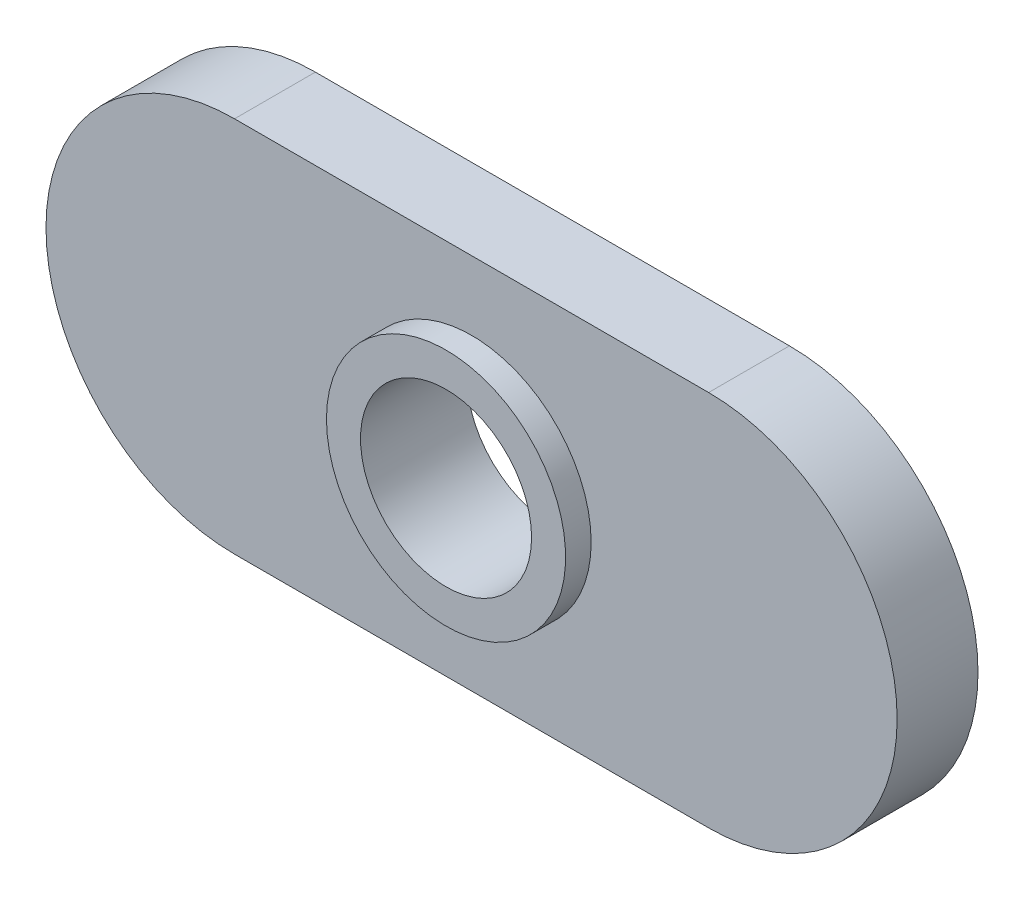
ISO-10303-21;
HEADER;
FILE_DESCRIPTION(('STEP AP214'),'2;1');
FILE_NAME('part.step','',(''),(''),'','','');
FILE_SCHEMA(('AUTOMOTIVE_DESIGN { 1 0 10303 214 1 1 1 1 }'));
ENDSEC;
DATA;
#1=APPLICATION_CONTEXT('core data for automotive mechanical design processes');
#2=APPLICATION_PROTOCOL_DEFINITION('international standard','automotive_design',2000,#1);
#3=PRODUCT_CONTEXT('',#1,'mechanical');
#4=PRODUCT('Part','Part','',(#3));
#5=PRODUCT_RELATED_PRODUCT_CATEGORY('part','',(#4));
#6=PRODUCT_DEFINITION_FORMATION('','',#4);
#7=PRODUCT_DEFINITION_CONTEXT('part definition',#1,'design');
#8=PRODUCT_DEFINITION('design','',#6,#7);
#9=PRODUCT_DEFINITION_SHAPE('','',#8);
#10=(LENGTH_UNIT() NAMED_UNIT(*) SI_UNIT(.MILLI.,.METRE.));
#11=(NAMED_UNIT(*) PLANE_ANGLE_UNIT() SI_UNIT($,.RADIAN.));
#12=(NAMED_UNIT(*) SI_UNIT($,.STERADIAN.) SOLID_ANGLE_UNIT());
#13=UNCERTAINTY_MEASURE_WITH_UNIT(LENGTH_MEASURE(1.E-05),#10,'distance_accuracy_value','');
#14=(GEOMETRIC_REPRESENTATION_CONTEXT(3) GLOBAL_UNCERTAINTY_ASSIGNED_CONTEXT((#13)) GLOBAL_UNIT_ASSIGNED_CONTEXT((#10,
#11,#12)) REPRESENTATION_CONTEXT('',''));
#15=CARTESIAN_POINT('',(0.,0.,0.));
#16=DIRECTION('',(0.,0.,1.));
#17=DIRECTION('',(1.,0.,0.));
#18=AXIS2_PLACEMENT_3D('',#15,#16,#17);
#19=CARTESIAN_POINT('',(111.278662660247,125.933065895994,0.));
#20=DIRECTION('',(0.,0.,1.));
#21=DIRECTION('',(1.,0.,0.));
#22=AXIS2_PLACEMENT_3D('',#19,#20,#21);
#23=CYLINDRICAL_SURFACE('',#22,5.62609999999999);
#24=CARTESIAN_POINT('',(111.278662660247,125.933065895994,2.413));
#25=DIRECTION('',(0.,0.,1.));
#26=DIRECTION('',(1.,0.,0.));
#27=AXIS2_PLACEMENT_3D('',#24,#25,#26);
#28=CIRCLE('',#27,5.62609999999999);
#29=CARTESIAN_POINT('',(111.278662660247,131.559165895994,2.413));
#30=VERTEX_POINT('',#29);
#31=CARTESIAN_POINT('',(111.278662660247,120.306965895994,2.413));
#32=VERTEX_POINT('',#31);
#33=EDGE_CURVE('E99',#30,#32,#28,.T.);
#34=ORIENTED_EDGE('',*,*,#33,.F.);
#35=DIRECTION('',(0.,0.,1.));
#36=VECTOR('',#35,1.);
#37=CARTESIAN_POINT('',(111.278662660247,131.559165895994,0.));
#38=LINE('',#37,#36);
#39=CARTESIAN_POINT('',(111.278662660247,131.559165895994,0.));
#40=VERTEX_POINT('',#39);
#41=EDGE_CURVE('E40',#40,#30,#38,.T.);
#42=ORIENTED_EDGE('',*,*,#41,.F.);
#43=CARTESIAN_POINT('',(111.278662660247,125.933065895994,0.));
#44=DIRECTION('',(0.,0.,1.));
#45=DIRECTION('',(1.,0.,0.));
#46=AXIS2_PLACEMENT_3D('',#43,#44,#45);
#47=CIRCLE('',#46,5.62609999999999);
#48=CARTESIAN_POINT('',(111.278662660247,120.306965895994,0.));
#49=VERTEX_POINT('',#48);
#50=EDGE_CURVE('E92',#40,#49,#47,.T.);
#51=ORIENTED_EDGE('',*,*,#50,.T.);
#52=DIRECTION('',(0.,0.,1.));
#53=VECTOR('',#52,1.);
#54=CARTESIAN_POINT('',(111.278662660247,120.306965895994,0.));
#55=LINE('',#54,#53);
#56=EDGE_CURVE('E75',#49,#32,#55,.T.);
#57=ORIENTED_EDGE('',*,*,#56,.T.);
#58=EDGE_LOOP('',(#34,#42,#51,#57));
#59=FACE_BOUND('',#58,.T.);
#60=ADVANCED_FACE('F32',(#59),#23,.T.);
#61=CARTESIAN_POINT('',(125.426462660247,131.559165895994,0.));
#62=DIRECTION('',(0.,1.,0.));
#63=DIRECTION('',(0.,0.,1.));
#64=AXIS2_PLACEMENT_3D('',#61,#62,#63);
#65=PLANE('',#64);
#66=DIRECTION('',(-1.,0.,0.));
#67=VECTOR('',#66,1.);
#68=CARTESIAN_POINT('',(125.426462660247,131.559165895994,2.413));
#69=LINE('',#68,#67);
#70=CARTESIAN_POINT('',(125.426462660247,131.559165895994,2.413));
#71=VERTEX_POINT('',#70);
#72=EDGE_CURVE('E94',#71,#30,#69,.T.);
#73=ORIENTED_EDGE('',*,*,#72,.F.);
#74=DIRECTION('',(0.,0.,1.));
#75=VECTOR('',#74,1.);
#76=CARTESIAN_POINT('',(125.426462660247,131.559165895994,0.));
#77=LINE('',#76,#75);
#78=CARTESIAN_POINT('',(125.426462660247,131.559165895994,0.));
#79=VERTEX_POINT('',#78);
#80=EDGE_CURVE('E64',#79,#71,#77,.T.);
#81=ORIENTED_EDGE('',*,*,#80,.F.);
#82=DIRECTION('',(-1.,0.,0.));
#83=VECTOR('',#82,1.);
#84=CARTESIAN_POINT('',(125.426462660247,131.559165895994,0.));
#85=LINE('',#84,#83);
#86=EDGE_CURVE('E89',#79,#40,#85,.T.);
#87=ORIENTED_EDGE('',*,*,#86,.T.);
#88=ORIENTED_EDGE('',*,*,#41,.T.);
#89=EDGE_LOOP('',(#73,#81,#87,#88));
#90=FACE_BOUND('',#89,.T.);
#91=ADVANCED_FACE('F111',(#90),#65,.T.);
#92=CARTESIAN_POINT('',(125.426462660247,125.933065895994,0.));
#93=DIRECTION('',(0.,0.,1.));
#94=DIRECTION('',(1.,0.,0.));
#95=AXIS2_PLACEMENT_3D('',#92,#93,#94);
#96=CYLINDRICAL_SURFACE('',#95,5.62609999999999);
#97=CARTESIAN_POINT('',(125.426462660247,125.933065895994,2.413));
#98=DIRECTION('',(0.,0.,1.));
#99=DIRECTION('',(1.,0.,0.));
#100=AXIS2_PLACEMENT_3D('',#97,#98,#99);
#101=CIRCLE('',#100,5.62609999999999);
#102=CARTESIAN_POINT('',(125.426462660247,120.306965895994,2.413));
#103=VERTEX_POINT('',#102);
#104=EDGE_CURVE('E83',#103,#71,#101,.T.);
#105=ORIENTED_EDGE('',*,*,#104,.F.);
#106=DIRECTION('',(0.,0.,1.));
#107=VECTOR('',#106,1.);
#108=CARTESIAN_POINT('',(125.426462660247,120.306965895994,0.));
#109=LINE('',#108,#107);
#110=CARTESIAN_POINT('',(125.426462660247,120.306965895994,0.));
#111=VERTEX_POINT('',#110);
#112=EDGE_CURVE('E78',#111,#103,#109,.T.);
#113=ORIENTED_EDGE('',*,*,#112,.F.);
#114=CARTESIAN_POINT('',(125.426462660247,125.933065895994,0.));
#115=DIRECTION('',(0.,0.,1.));
#116=DIRECTION('',(1.,0.,0.));
#117=AXIS2_PLACEMENT_3D('',#114,#115,#116);
#118=CIRCLE('',#117,5.62609999999999);
#119=EDGE_CURVE('E81',#111,#79,#118,.T.);
#120=ORIENTED_EDGE('',*,*,#119,.T.);
#121=ORIENTED_EDGE('',*,*,#80,.T.);
#122=EDGE_LOOP('',(#105,#113,#120,#121));
#123=FACE_BOUND('',#122,.T.);
#124=ADVANCED_FACE('F80',(#123),#96,.T.);
#125=CARTESIAN_POINT('',(111.278662660247,120.306965895994,0.));
#126=DIRECTION('',(0.,-1.,0.));
#127=DIRECTION('',(1.,0.,0.));
#128=AXIS2_PLACEMENT_3D('',#125,#126,#127);
#129=PLANE('',#128);
#130=DIRECTION('',(1.,0.,0.));
#131=VECTOR('',#130,1.);
#132=CARTESIAN_POINT('',(111.278662660247,120.306965895994,2.413));
#133=LINE('',#132,#131);
#134=EDGE_CURVE('E102',#32,#103,#133,.T.);
#135=ORIENTED_EDGE('',*,*,#134,.F.);
#136=ORIENTED_EDGE('',*,*,#56,.F.);
#137=DIRECTION('',(1.,0.,0.));
#138=VECTOR('',#137,1.);
#139=CARTESIAN_POINT('',(111.278662660247,120.306965895994,0.));
#140=LINE('',#139,#138);
#141=EDGE_CURVE('E88',#49,#111,#140,.T.);
#142=ORIENTED_EDGE('',*,*,#141,.T.);
#143=ORIENTED_EDGE('',*,*,#112,.T.);
#144=EDGE_LOOP('',(#135,#136,#142,#143));
#145=FACE_BOUND('',#144,.T.);
#146=ADVANCED_FACE('F91',(#145),#129,.T.);
#147=CARTESIAN_POINT('',(111.278662660247,125.933065895994,0.));
#148=DIRECTION('',(0.,0.,1.));
#149=DIRECTION('',(1.,0.,0.));
#150=AXIS2_PLACEMENT_3D('',#147,#148,#149);
#151=PLANE('',#150);
#152=CARTESIAN_POINT('',(118.352562660247,125.933065895994,0.));
#153=DIRECTION('',(0.,0.,1.));
#154=DIRECTION('',(1.,0.,0.));
#155=AXIS2_PLACEMENT_3D('',#152,#153,#154);
#156=CIRCLE('',#155,2.55269999999999);
#157=CARTESIAN_POINT('',(120.905262660247,125.933065895994,0.));
#158=VERTEX_POINT('',#157);
#159=EDGE_CURVE('E150',#158,#158,#156,.T.);
#160=ORIENTED_EDGE('',*,*,#159,.T.);
#161=EDGE_LOOP('',(#160));
#162=FACE_BOUND('',#161,.T.);
#163=ORIENTED_EDGE('',*,*,#50,.F.);
#164=ORIENTED_EDGE('',*,*,#86,.F.);
#165=ORIENTED_EDGE('',*,*,#119,.F.);
#166=ORIENTED_EDGE('',*,*,#141,.F.);
#167=EDGE_LOOP('',(#163,#164,#165,#166));
#168=FACE_BOUND('',#167,.T.);
#169=ADVANCED_FACE('F87',(#162,#168),#151,.F.);
#170=CARTESIAN_POINT('',(111.278662660247,125.933065895994,2.413));
#171=DIRECTION('',(0.,0.,1.));
#172=DIRECTION('',(1.,0.,0.));
#173=AXIS2_PLACEMENT_3D('',#170,#171,#172);
#174=PLANE('',#173);
#175=CARTESIAN_POINT('',(118.352562660247,125.933065895994,2.413));
#176=DIRECTION('',(0.,0.,1.));
#177=DIRECTION('',(1.,0.,0.));
#178=AXIS2_PLACEMENT_3D('',#175,#176,#177);
#179=CIRCLE('',#178,3.56869999999999);
#180=CARTESIAN_POINT('',(121.921262660247,125.933065895994,2.413));
#181=VERTEX_POINT('',#180);
#182=EDGE_CURVE('E11',#181,#181,#179,.T.);
#183=ORIENTED_EDGE('',*,*,#182,.F.);
#184=EDGE_LOOP('',(#183));
#185=FACE_BOUND('',#184,.T.);
#186=ORIENTED_EDGE('',*,*,#33,.T.);
#187=ORIENTED_EDGE('',*,*,#134,.T.);
#188=ORIENTED_EDGE('',*,*,#104,.T.);
#189=ORIENTED_EDGE('',*,*,#72,.T.);
#190=EDGE_LOOP('',(#186,#187,#188,#189));
#191=FACE_BOUND('',#190,.T.);
#192=ADVANCED_FACE('F110',(#185,#191),#174,.T.);
#193=CARTESIAN_POINT('',(118.352562660247,125.933065895994,3.175));
#194=DIRECTION('',(0.,0.,-1.));
#195=DIRECTION('',(-1.,0.,0.));
#196=AXIS2_PLACEMENT_3D('',#193,#194,#195);
#197=CYLINDRICAL_SURFACE('',#196,3.56869999999999);
#198=CARTESIAN_POINT('',(118.352562660247,125.933065895994,3.175));
#199=DIRECTION('',(0.,0.,-1.));
#200=DIRECTION('',(-1.,0.,0.));
#201=AXIS2_PLACEMENT_3D('',#198,#199,#200);
#202=CIRCLE('',#201,3.56869999999999);
#203=CARTESIAN_POINT('',(114.783862660247,125.933065895994,3.175));
#204=VERTEX_POINT('',#203);
#205=EDGE_CURVE('E103',#204,#204,#202,.T.);
#206=ORIENTED_EDGE('',*,*,#205,.T.);
#207=EDGE_LOOP('',(#206));
#208=FACE_BOUND('',#207,.T.);
#209=ORIENTED_EDGE('',*,*,#182,.T.);
#210=EDGE_LOOP('',(#209));
#211=FACE_BOUND('',#210,.T.);
#212=ADVANCED_FACE('F129',(#208,#211),#197,.T.);
#213=CARTESIAN_POINT('',(121.921262660247,125.933065895994,3.175));
#214=DIRECTION('',(0.,0.,1.));
#215=DIRECTION('',(1.,0.,0.));
#216=AXIS2_PLACEMENT_3D('',#213,#214,#215);
#217=PLANE('',#216);
#218=CARTESIAN_POINT('',(118.352562660247,125.933065895994,3.175));
#219=DIRECTION('',(0.,0.,1.));
#220=DIRECTION('',(1.,0.,0.));
#221=AXIS2_PLACEMENT_3D('',#218,#219,#220);
#222=CIRCLE('',#221,2.55269999999999);
#223=CARTESIAN_POINT('',(120.905262660247,125.933065895994,3.175));
#224=VERTEX_POINT('',#223);
#225=EDGE_CURVE('E148',#224,#224,#222,.T.);
#226=ORIENTED_EDGE('',*,*,#225,.F.);
#227=EDGE_LOOP('',(#226));
#228=FACE_BOUND('',#227,.T.);
#229=ORIENTED_EDGE('',*,*,#205,.F.);
#230=EDGE_LOOP('',(#229));
#231=FACE_BOUND('',#230,.T.);
#232=ADVANCED_FACE('F135',(#228,#231),#217,.T.);
#233=CARTESIAN_POINT('',(118.352562660247,125.933065895994,3.175));
#234=DIRECTION('',(0.,0.,1.));
#235=DIRECTION('',(1.,0.,0.));
#236=AXIS2_PLACEMENT_3D('',#233,#234,#235);
#237=CYLINDRICAL_SURFACE('',#236,2.55269999999999);
#238=ORIENTED_EDGE('',*,*,#225,.T.);
#239=EDGE_LOOP('',(#238));
#240=FACE_BOUND('',#239,.T.);
#241=ORIENTED_EDGE('',*,*,#159,.F.);
#242=EDGE_LOOP('',(#241));
#243=FACE_BOUND('',#242,.T.);
#244=ADVANCED_FACE('F139',(#240,#243),#237,.F.);
#245=CLOSED_SHELL('',(#60,#91,#124,#146,#169,#192,#212,#232,#244));
#246=MANIFOLD_SOLID_BREP('B2',#245);
#247=ADVANCED_BREP_SHAPE_REPRESENTATION('',(#18,#246),#14);
#248=SHAPE_DEFINITION_REPRESENTATION(#9,#247);
ENDSEC;
END-ISO-10303-21;
